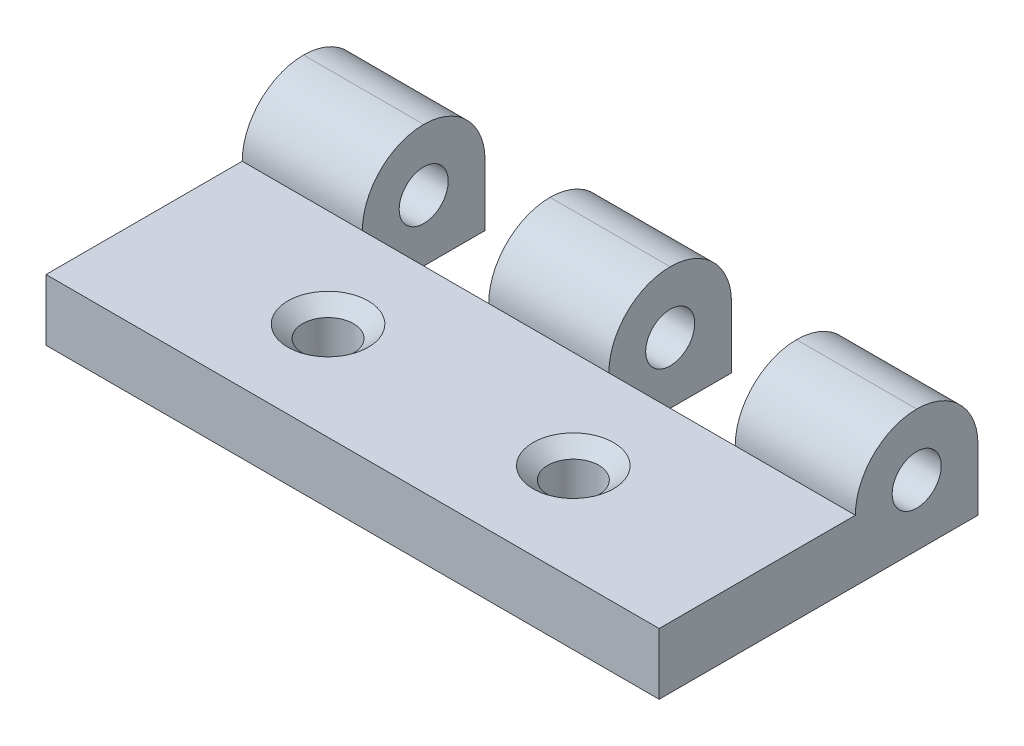
ISO-10303-21;
HEADER;
FILE_DESCRIPTION(('STEP AP214'),'2;1');
FILE_NAME('part.step','',(''),(''),'','','');
FILE_SCHEMA(('AUTOMOTIVE_DESIGN { 1 0 10303 214 1 1 1 1 }'));
ENDSEC;
DATA;
#1=APPLICATION_CONTEXT('core data for automotive mechanical design processes');
#2=APPLICATION_PROTOCOL_DEFINITION('international standard','automotive_design',2000,#1);
#3=PRODUCT_CONTEXT('',#1,'mechanical');
#4=PRODUCT('Part','Part','',(#3));
#5=PRODUCT_RELATED_PRODUCT_CATEGORY('part','',(#4));
#6=PRODUCT_DEFINITION_FORMATION('','',#4);
#7=PRODUCT_DEFINITION_CONTEXT('part definition',#1,'design');
#8=PRODUCT_DEFINITION('design','',#6,#7);
#9=PRODUCT_DEFINITION_SHAPE('','',#8);
#10=(LENGTH_UNIT() NAMED_UNIT(*) SI_UNIT(.MILLI.,.METRE.));
#11=(NAMED_UNIT(*) PLANE_ANGLE_UNIT() SI_UNIT($,.RADIAN.));
#12=(NAMED_UNIT(*) SI_UNIT($,.STERADIAN.) SOLID_ANGLE_UNIT());
#13=UNCERTAINTY_MEASURE_WITH_UNIT(LENGTH_MEASURE(1.E-05),#10,'distance_accuracy_value','');
#14=(GEOMETRIC_REPRESENTATION_CONTEXT(3) GLOBAL_UNCERTAINTY_ASSIGNED_CONTEXT((#13)) GLOBAL_UNIT_ASSIGNED_CONTEXT((#10,
#11,#12)) REPRESENTATION_CONTEXT('',''));
#15=CARTESIAN_POINT('',(0.,0.,0.));
#16=DIRECTION('',(0.,0.,1.));
#17=DIRECTION('',(1.,0.,0.));
#18=AXIS2_PLACEMENT_3D('',#15,#16,#17);
#19=CARTESIAN_POINT('',(-74.9999999999999,10.,-176.));
#20=DIRECTION('',(-1.,0.,0.));
#21=DIRECTION('',(0.,0.,1.));
#22=AXIS2_PLACEMENT_3D('',#19,#20,#21);
#23=PLANE('',#22);
#24=CARTESIAN_POINT('',(-74.9999999999999,5.,-171.));
#25=DIRECTION('',(-1.,0.,0.));
#26=DIRECTION('',(0.,0.,1.));
#27=AXIS2_PLACEMENT_3D('',#24,#25,#26);
#28=CIRCLE('',#27,2.);
#29=CARTESIAN_POINT('',(-74.9999999999999,5.,-169.));
#30=VERTEX_POINT('',#29);
#31=EDGE_CURVE('E206',#30,#30,#28,.T.);
#32=ORIENTED_EDGE('',*,*,#31,.T.);
#33=EDGE_LOOP('',(#32));
#34=FACE_BOUND('',#33,.T.);
#35=DIRECTION('',(0.,-1.,0.));
#36=VECTOR('',#35,1.);
#37=CARTESIAN_POINT('',(-74.9999999999999,10.,-176.));
#38=LINE('',#37,#36);
#39=CARTESIAN_POINT('',(-74.9999999999999,5.,-176.));
#40=VERTEX_POINT('',#39);
#41=CARTESIAN_POINT('',(-74.9999999999999,0.,-176.));
#42=VERTEX_POINT('',#41);
#43=EDGE_CURVE('E277',#40,#42,#38,.T.);
#44=ORIENTED_EDGE('',*,*,#43,.F.);
#45=CARTESIAN_POINT('',(-74.9999999999999,5.,-171.));
#46=DIRECTION('',(-1.,0.,0.));
#47=DIRECTION('',(0.,0.,1.));
#48=AXIS2_PLACEMENT_3D('',#45,#46,#47);
#49=CIRCLE('',#48,5.);
#50=CARTESIAN_POINT('',(-74.9999999999999,10.,-171.));
#51=VERTEX_POINT('',#50);
#52=EDGE_CURVE('E181',#40,#51,#49,.F.);
#53=ORIENTED_EDGE('',*,*,#52,.T.);
#54=CARTESIAN_POINT('',(-74.9999999999999,5.,-171.));
#55=DIRECTION('',(1.,0.,0.));
#56=DIRECTION('',(0.,0.,1.));
#57=AXIS2_PLACEMENT_3D('',#54,#55,#56);
#58=CIRCLE('',#57,4.99999999999992);
#59=CARTESIAN_POINT('',(-74.9999999999999,5.,-166.));
#60=VERTEX_POINT('',#59);
#61=EDGE_CURVE('E160',#51,#60,#58,.T.);
#62=ORIENTED_EDGE('',*,*,#61,.T.);
#63=DIRECTION('',(0.,0.,1.));
#64=VECTOR('',#63,1.);
#65=CARTESIAN_POINT('',(-74.9999999999999,5.,-150.));
#66=LINE('',#65,#64);
#67=CARTESIAN_POINT('',(-74.9999999999999,5.,-150.));
#68=VERTEX_POINT('',#67);
#69=EDGE_CURVE('E172',#60,#68,#66,.T.);
#70=ORIENTED_EDGE('',*,*,#69,.T.);
#71=DIRECTION('',(0.,-1.,0.));
#72=VECTOR('',#71,1.);
#73=CARTESIAN_POINT('',(-74.9999999999999,10.,-150.));
#74=LINE('',#73,#72);
#75=CARTESIAN_POINT('',(-74.9999999999999,0.,-150.));
#76=VERTEX_POINT('',#75);
#77=EDGE_CURVE('E279',#68,#76,#74,.T.);
#78=ORIENTED_EDGE('',*,*,#77,.T.);
#79=DIRECTION('',(0.,0.,-1.));
#80=VECTOR('',#79,1.);
#81=CARTESIAN_POINT('',(-74.9999999999999,0.,-176.));
#82=LINE('',#81,#80);
#83=EDGE_CURVE('E226',#76,#42,#82,.T.);
#84=ORIENTED_EDGE('',*,*,#83,.T.);
#85=EDGE_LOOP('',(#44,#53,#62,#70,#78,#84));
#86=FACE_BOUND('',#85,.T.);
#87=ADVANCED_FACE('F41',(#34,#86),#23,.F.);
#88=CARTESIAN_POINT('',(-84.7999999999999,10.,-166.));
#89=DIRECTION('',(1.,0.,0.));
#90=DIRECTION('',(0.,0.,-1.));
#91=AXIS2_PLACEMENT_3D('',#88,#89,#90);
#92=PLANE('',#91);
#93=CARTESIAN_POINT('',(-84.7999999999999,5.,-171.));
#94=DIRECTION('',(1.,0.,0.));
#95=DIRECTION('',(0.,0.,-1.));
#96=AXIS2_PLACEMENT_3D('',#93,#94,#95);
#97=CIRCLE('',#96,2.);
#98=CARTESIAN_POINT('',(-84.7999999999999,5.,-173.));
#99=VERTEX_POINT('',#98);
#100=EDGE_CURVE('E220',#99,#99,#97,.T.);
#101=ORIENTED_EDGE('',*,*,#100,.T.);
#102=EDGE_LOOP('',(#101));
#103=FACE_BOUND('',#102,.T.);
#104=CARTESIAN_POINT('',(-84.7999999999999,5.,-171.));
#105=DIRECTION('',(1.,0.,0.));
#106=DIRECTION('',(0.,0.,-1.));
#107=AXIS2_PLACEMENT_3D('',#104,#105,#106);
#108=CIRCLE('',#107,4.99999999999992);
#109=CARTESIAN_POINT('',(-84.7999999999999,5.,-166.));
#110=VERTEX_POINT('',#109);
#111=CARTESIAN_POINT('',(-84.7999999999999,9.99999999999992,-171.));
#112=VERTEX_POINT('',#111);
#113=EDGE_CURVE('E163',#110,#112,#108,.F.);
#114=ORIENTED_EDGE('',*,*,#113,.T.);
#115=CARTESIAN_POINT('',(-84.7999999999999,5.,-171.));
#116=DIRECTION('',(1.,0.,0.));
#117=DIRECTION('',(0.,0.,-1.));
#118=AXIS2_PLACEMENT_3D('',#115,#116,#117);
#119=CIRCLE('',#118,5.);
#120=CARTESIAN_POINT('',(-84.7999999999999,5.,-176.));
#121=VERTEX_POINT('',#120);
#122=EDGE_CURVE('E287',#112,#121,#119,.F.);
#123=ORIENTED_EDGE('',*,*,#122,.T.);
#124=DIRECTION('',(0.,-1.,0.));
#125=VECTOR('',#124,1.);
#126=CARTESIAN_POINT('',(-84.7999999999999,10.,-176.));
#127=LINE('',#126,#125);
#128=CARTESIAN_POINT('',(-84.7999999999999,0.,-176.));
#129=VERTEX_POINT('',#128);
#130=EDGE_CURVE('E275',#121,#129,#127,.T.);
#131=ORIENTED_EDGE('',*,*,#130,.T.);
#132=DIRECTION('',(0.,0.,1.));
#133=VECTOR('',#132,1.);
#134=CARTESIAN_POINT('',(-84.7999999999999,0.,-166.));
#135=LINE('',#134,#133);
#136=CARTESIAN_POINT('',(-84.7999999999999,0.,-166.));
#137=VERTEX_POINT('',#136);
#138=EDGE_CURVE('E232',#129,#137,#135,.T.);
#139=ORIENTED_EDGE('',*,*,#138,.T.);
#140=DIRECTION('',(0.,-1.,0.));
#141=VECTOR('',#140,1.);
#142=CARTESIAN_POINT('',(-84.7999999999999,10.,-166.));
#143=LINE('',#142,#141);
#144=EDGE_CURVE('E273',#110,#137,#143,.T.);
#145=ORIENTED_EDGE('',*,*,#144,.F.);
#146=EDGE_LOOP('',(#114,#123,#131,#139,#145));
#147=FACE_BOUND('',#146,.T.);
#148=ADVANCED_FACE('F342',(#103,#147),#92,.F.);
#149=CARTESIAN_POINT('',(-95.0999999999999,10.,-176.));
#150=DIRECTION('',(-1.,0.,0.));
#151=DIRECTION('',(0.,0.,1.));
#152=AXIS2_PLACEMENT_3D('',#149,#150,#151);
#153=PLANE('',#152);
#154=CARTESIAN_POINT('',(-95.0999999999999,5.,-171.));
#155=DIRECTION('',(-1.,0.,0.));
#156=DIRECTION('',(0.,0.,1.));
#157=AXIS2_PLACEMENT_3D('',#154,#155,#156);
#158=CIRCLE('',#157,2.);
#159=CARTESIAN_POINT('',(-95.0999999999999,5.,-169.));
#160=VERTEX_POINT('',#159);
#161=EDGE_CURVE('E217',#160,#160,#158,.T.);
#162=ORIENTED_EDGE('',*,*,#161,.T.);
#163=EDGE_LOOP('',(#162));
#164=FACE_BOUND('',#163,.T.);
#165=DIRECTION('',(0.,-1.,0.));
#166=VECTOR('',#165,1.);
#167=CARTESIAN_POINT('',(-95.0999999999999,10.,-176.));
#168=LINE('',#167,#166);
#169=CARTESIAN_POINT('',(-95.0999999999999,5.,-176.));
#170=VERTEX_POINT('',#169);
#171=CARTESIAN_POINT('',(-95.0999999999999,0.,-176.));
#172=VERTEX_POINT('',#171);
#173=EDGE_CURVE('E269',#170,#172,#168,.T.);
#174=ORIENTED_EDGE('',*,*,#173,.F.);
#175=CARTESIAN_POINT('',(-95.0999999999999,5.,-171.));
#176=DIRECTION('',(-1.,0.,0.));
#177=DIRECTION('',(0.,0.,1.));
#178=AXIS2_PLACEMENT_3D('',#175,#176,#177);
#179=CIRCLE('',#178,5.);
#180=CARTESIAN_POINT('',(-95.0999999999999,9.99999999999992,-171.));
#181=VERTEX_POINT('',#180);
#182=EDGE_CURVE('E296',#170,#181,#179,.F.);
#183=ORIENTED_EDGE('',*,*,#182,.T.);
#184=CARTESIAN_POINT('',(-95.0999999999999,5.,-171.));
#185=DIRECTION('',(-1.,0.,0.));
#186=DIRECTION('',(0.,0.,1.));
#187=AXIS2_PLACEMENT_3D('',#184,#185,#186);
#188=CIRCLE('',#187,4.99999999999992);
#189=CARTESIAN_POINT('',(-95.0999999999999,5.,-166.));
#190=VERTEX_POINT('',#189);
#191=EDGE_CURVE('E201',#181,#190,#188,.F.);
#192=ORIENTED_EDGE('',*,*,#191,.T.);
#193=DIRECTION('',(0.,-1.,0.));
#194=VECTOR('',#193,1.);
#195=CARTESIAN_POINT('',(-95.0999999999999,10.,-166.));
#196=LINE('',#195,#194);
#197=CARTESIAN_POINT('',(-95.0999999999999,0.,-166.));
#198=VERTEX_POINT('',#197);
#199=EDGE_CURVE('E271',#190,#198,#196,.T.);
#200=ORIENTED_EDGE('',*,*,#199,.T.);
#201=DIRECTION('',(0.,0.,-1.));
#202=VECTOR('',#201,1.);
#203=CARTESIAN_POINT('',(-95.0999999999999,0.,-176.));
#204=LINE('',#203,#202);
#205=EDGE_CURVE('E238',#198,#172,#204,.T.);
#206=ORIENTED_EDGE('',*,*,#205,.T.);
#207=EDGE_LOOP('',(#174,#183,#192,#200,#206));
#208=FACE_BOUND('',#207,.T.);
#209=ADVANCED_FACE('F349',(#164,#208),#153,.F.);
#210=CARTESIAN_POINT('',(-104.9,10.,-166.));
#211=DIRECTION('',(1.,0.,0.));
#212=DIRECTION('',(0.,0.,-1.));
#213=AXIS2_PLACEMENT_3D('',#210,#211,#212);
#214=PLANE('',#213);
#215=CARTESIAN_POINT('',(-104.9,5.,-171.));
#216=DIRECTION('',(1.,0.,0.));
#217=DIRECTION('',(0.,0.,-1.));
#218=AXIS2_PLACEMENT_3D('',#215,#216,#217);
#219=CIRCLE('',#218,2.);
#220=CARTESIAN_POINT('',(-104.9,5.,-173.));
#221=VERTEX_POINT('',#220);
#222=EDGE_CURVE('E214',#221,#221,#219,.T.);
#223=ORIENTED_EDGE('',*,*,#222,.T.);
#224=EDGE_LOOP('',(#223));
#225=FACE_BOUND('',#224,.T.);
#226=CARTESIAN_POINT('',(-104.9,5.,-171.));
#227=DIRECTION('',(1.,0.,0.));
#228=DIRECTION('',(0.,0.,-1.));
#229=AXIS2_PLACEMENT_3D('',#226,#227,#228);
#230=CIRCLE('',#229,4.99999999999992);
#231=CARTESIAN_POINT('',(-104.9,5.,-166.));
#232=VERTEX_POINT('',#231);
#233=CARTESIAN_POINT('',(-104.9,9.99999999999992,-171.));
#234=VERTEX_POINT('',#233);
#235=EDGE_CURVE('E198',#232,#234,#230,.F.);
#236=ORIENTED_EDGE('',*,*,#235,.T.);
#237=CARTESIAN_POINT('',(-104.9,5.,-171.));
#238=DIRECTION('',(1.,0.,0.));
#239=DIRECTION('',(0.,0.,-1.));
#240=AXIS2_PLACEMENT_3D('',#237,#238,#239);
#241=CIRCLE('',#240,5.);
#242=CARTESIAN_POINT('',(-104.9,5.,-176.));
#243=VERTEX_POINT('',#242);
#244=EDGE_CURVE('E292',#234,#243,#241,.F.);
#245=ORIENTED_EDGE('',*,*,#244,.T.);
#246=DIRECTION('',(0.,-1.,0.));
#247=VECTOR('',#246,1.);
#248=CARTESIAN_POINT('',(-104.9,10.,-176.));
#249=LINE('',#248,#247);
#250=CARTESIAN_POINT('',(-104.9,0.,-176.));
#251=VERTEX_POINT('',#250);
#252=EDGE_CURVE('E267',#243,#251,#249,.T.);
#253=ORIENTED_EDGE('',*,*,#252,.T.);
#254=DIRECTION('',(0.,0.,1.));
#255=VECTOR('',#254,1.);
#256=CARTESIAN_POINT('',(-104.9,0.,-166.));
#257=LINE('',#256,#255);
#258=CARTESIAN_POINT('',(-104.9,0.,-166.));
#259=VERTEX_POINT('',#258);
#260=EDGE_CURVE('E244',#251,#259,#257,.T.);
#261=ORIENTED_EDGE('',*,*,#260,.T.);
#262=DIRECTION('',(0.,-1.,0.));
#263=VECTOR('',#262,1.);
#264=CARTESIAN_POINT('',(-104.9,10.,-166.));
#265=LINE('',#264,#263);
#266=EDGE_CURVE('E265',#232,#259,#265,.T.);
#267=ORIENTED_EDGE('',*,*,#266,.F.);
#268=EDGE_LOOP('',(#236,#245,#253,#261,#267));
#269=FACE_BOUND('',#268,.T.);
#270=ADVANCED_FACE('F411',(#225,#269),#214,.F.);
#271=CARTESIAN_POINT('',(-115.2,10.,-176.));
#272=DIRECTION('',(-1.,0.,0.));
#273=DIRECTION('',(0.,0.,1.));
#274=AXIS2_PLACEMENT_3D('',#271,#272,#273);
#275=PLANE('',#274);
#276=CARTESIAN_POINT('',(-115.2,5.,-171.));
#277=DIRECTION('',(-1.,0.,0.));
#278=DIRECTION('',(0.,0.,1.));
#279=AXIS2_PLACEMENT_3D('',#276,#277,#278);
#280=CIRCLE('',#279,2.);
#281=CARTESIAN_POINT('',(-115.2,5.,-169.));
#282=VERTEX_POINT('',#281);
#283=EDGE_CURVE('E209',#282,#282,#280,.T.);
#284=ORIENTED_EDGE('',*,*,#283,.T.);
#285=EDGE_LOOP('',(#284));
#286=FACE_BOUND('',#285,.T.);
#287=DIRECTION('',(0.,-1.,0.));
#288=VECTOR('',#287,1.);
#289=CARTESIAN_POINT('',(-115.2,10.,-176.));
#290=LINE('',#289,#288);
#291=CARTESIAN_POINT('',(-115.2,5.,-176.));
#292=VERTEX_POINT('',#291);
#293=CARTESIAN_POINT('',(-115.2,0.,-176.));
#294=VERTEX_POINT('',#293);
#295=EDGE_CURVE('E261',#292,#294,#290,.T.);
#296=ORIENTED_EDGE('',*,*,#295,.F.);
#297=CARTESIAN_POINT('',(-115.2,5.,-171.));
#298=DIRECTION('',(-1.,0.,0.));
#299=DIRECTION('',(0.,0.,1.));
#300=AXIS2_PLACEMENT_3D('',#297,#298,#299);
#301=CIRCLE('',#300,5.);
#302=CARTESIAN_POINT('',(-115.2,9.99999999999992,-171.));
#303=VERTEX_POINT('',#302);
#304=EDGE_CURVE('E300',#292,#303,#301,.F.);
#305=ORIENTED_EDGE('',*,*,#304,.T.);
#306=CARTESIAN_POINT('',(-115.2,5.,-171.));
#307=DIRECTION('',(-1.,0.,0.));
#308=DIRECTION('',(0.,0.,1.));
#309=AXIS2_PLACEMENT_3D('',#306,#307,#308);
#310=CIRCLE('',#309,4.99999999999992);
#311=CARTESIAN_POINT('',(-115.2,5.,-166.));
#312=VERTEX_POINT('',#311);
#313=EDGE_CURVE('E193',#303,#312,#310,.F.);
#314=ORIENTED_EDGE('',*,*,#313,.T.);
#315=DIRECTION('',(0.,-1.,0.));
#316=VECTOR('',#315,1.);
#317=CARTESIAN_POINT('',(-115.2,10.,-166.));
#318=LINE('',#317,#316);
#319=CARTESIAN_POINT('',(-115.2,0.,-166.));
#320=VERTEX_POINT('',#319);
#321=EDGE_CURVE('E263',#312,#320,#318,.T.);
#322=ORIENTED_EDGE('',*,*,#321,.T.);
#323=DIRECTION('',(0.,0.,-1.));
#324=VECTOR('',#323,1.);
#325=CARTESIAN_POINT('',(-115.2,0.,-176.));
#326=LINE('',#325,#324);
#327=EDGE_CURVE('E250',#320,#294,#326,.T.);
#328=ORIENTED_EDGE('',*,*,#327,.T.);
#329=EDGE_LOOP('',(#296,#305,#314,#322,#328));
#330=FACE_BOUND('',#329,.T.);
#331=ADVANCED_FACE('F377',(#286,#330),#275,.F.);
#332=CARTESIAN_POINT('',(-125.,10.,-166.));
#333=DIRECTION('',(1.,0.,0.));
#334=DIRECTION('',(0.,0.,-1.));
#335=AXIS2_PLACEMENT_3D('',#332,#333,#334);
#336=PLANE('',#335);
#337=CARTESIAN_POINT('',(-125.,5.,-171.));
#338=DIRECTION('',(-1.,0.,0.));
#339=DIRECTION('',(0.,0.,1.));
#340=AXIS2_PLACEMENT_3D('',#337,#338,#339);
#341=CIRCLE('',#340,2.);
#342=CARTESIAN_POINT('',(-125.,5.,-169.));
#343=VERTEX_POINT('',#342);
#344=EDGE_CURVE('E205',#343,#343,#341,.T.);
#345=ORIENTED_EDGE('',*,*,#344,.F.);
#346=EDGE_LOOP('',(#345));
#347=FACE_BOUND('',#346,.T.);
#348=CARTESIAN_POINT('',(-125.,5.,-171.));
#349=DIRECTION('',(1.,0.,0.));
#350=DIRECTION('',(0.,0.,1.));
#351=AXIS2_PLACEMENT_3D('',#348,#349,#350);
#352=CIRCLE('',#351,4.99999999999992);
#353=CARTESIAN_POINT('',(-125.,9.99999999999992,-171.));
#354=VERTEX_POINT('',#353);
#355=CARTESIAN_POINT('',(-125.,5.,-166.));
#356=VERTEX_POINT('',#355);
#357=EDGE_CURVE('E184',#354,#356,#352,.T.);
#358=ORIENTED_EDGE('',*,*,#357,.F.);
#359=CARTESIAN_POINT('',(-125.,5.,-171.));
#360=DIRECTION('',(1.,0.,0.));
#361=DIRECTION('',(0.,0.,-1.));
#362=AXIS2_PLACEMENT_3D('',#359,#360,#361);
#363=CIRCLE('',#362,5.);
#364=CARTESIAN_POINT('',(-125.,5.,-176.));
#365=VERTEX_POINT('',#364);
#366=EDGE_CURVE('E65',#354,#365,#363,.F.);
#367=ORIENTED_EDGE('',*,*,#366,.T.);
#368=DIRECTION('',(0.,-1.,0.));
#369=VECTOR('',#368,1.);
#370=CARTESIAN_POINT('',(-125.,10.,-176.));
#371=LINE('',#370,#369);
#372=CARTESIAN_POINT('',(-125.,0.,-176.));
#373=VERTEX_POINT('',#372);
#374=EDGE_CURVE('E259',#365,#373,#371,.T.);
#375=ORIENTED_EDGE('',*,*,#374,.T.);
#376=DIRECTION('',(0.,0.,1.));
#377=VECTOR('',#376,1.);
#378=CARTESIAN_POINT('',(-125.,0.,-166.));
#379=LINE('',#378,#377);
#380=CARTESIAN_POINT('',(-125.,0.,-150.));
#381=VERTEX_POINT('',#380);
#382=EDGE_CURVE('E256',#373,#381,#379,.T.);
#383=ORIENTED_EDGE('',*,*,#382,.T.);
#384=DIRECTION('',(0.,-1.,0.));
#385=VECTOR('',#384,1.);
#386=CARTESIAN_POINT('',(-125.,10.,-150.));
#387=LINE('',#386,#385);
#388=CARTESIAN_POINT('',(-125.,5.,-150.));
#389=VERTEX_POINT('',#388);
#390=EDGE_CURVE('E281',#389,#381,#387,.T.);
#391=ORIENTED_EDGE('',*,*,#390,.F.);
#392=DIRECTION('',(0.,0.,1.));
#393=VECTOR('',#392,1.);
#394=CARTESIAN_POINT('',(-125.,5.,-150.));
#395=LINE('',#394,#393);
#396=EDGE_CURVE('E182',#356,#389,#395,.T.);
#397=ORIENTED_EDGE('',*,*,#396,.F.);
#398=EDGE_LOOP('',(#358,#367,#375,#383,#391,#397));
#399=FACE_BOUND('',#398,.T.);
#400=ADVANCED_FACE('F357',(#347,#399),#336,.F.);
#401=CARTESIAN_POINT('',(-125.,10.,-150.));
#402=DIRECTION('',(0.,0.,-1.));
#403=DIRECTION('',(-1.,0.,0.));
#404=AXIS2_PLACEMENT_3D('',#401,#402,#403);
#405=PLANE('',#404);
#406=ORIENTED_EDGE('',*,*,#77,.F.);
#407=DIRECTION('',(-1.,0.,0.));
#408=VECTOR('',#407,1.);
#409=CARTESIAN_POINT('',(-74.9999999999999,5.,-150.));
#410=LINE('',#409,#408);
#411=EDGE_CURVE('E167',#68,#389,#410,.T.);
#412=ORIENTED_EDGE('',*,*,#411,.T.);
#413=ORIENTED_EDGE('',*,*,#390,.T.);
#414=DIRECTION('',(1.,0.,0.));
#415=VECTOR('',#414,1.);
#416=CARTESIAN_POINT('',(-125.,0.,-150.));
#417=LINE('',#416,#415);
#418=EDGE_CURVE('E223',#381,#76,#417,.T.);
#419=ORIENTED_EDGE('',*,*,#418,.T.);
#420=EDGE_LOOP('',(#406,#412,#413,#419));
#421=FACE_BOUND('',#420,.T.);
#422=ADVANCED_FACE('F355',(#421),#405,.F.);
#423=CARTESIAN_POINT('',(-84.7999999999999,10.,-176.));
#424=DIRECTION('',(0.,0.,1.));
#425=DIRECTION('',(1.,0.,0.));
#426=AXIS2_PLACEMENT_3D('',#423,#424,#425);
#427=PLANE('',#426);
#428=ORIENTED_EDGE('',*,*,#130,.F.);
#429=DIRECTION('',(-1.,0.,0.));
#430=VECTOR('',#429,1.);
#431=CARTESIAN_POINT('',(-84.7999999999999,5.,-176.));
#432=LINE('',#431,#430);
#433=EDGE_CURVE('E289',#121,#40,#432,.F.);
#434=ORIENTED_EDGE('',*,*,#433,.T.);
#435=ORIENTED_EDGE('',*,*,#43,.T.);
#436=DIRECTION('',(-1.,0.,0.));
#437=VECTOR('',#436,1.);
#438=CARTESIAN_POINT('',(-84.7999999999999,0.,-176.));
#439=LINE('',#438,#437);
#440=EDGE_CURVE('E229',#42,#129,#439,.T.);
#441=ORIENTED_EDGE('',*,*,#440,.T.);
#442=EDGE_LOOP('',(#428,#434,#435,#441));
#443=FACE_BOUND('',#442,.T.);
#444=ADVANCED_FACE('F354',(#443),#427,.F.);
#445=CARTESIAN_POINT('',(-95.0999999999999,10.,-166.));
#446=DIRECTION('',(0.,0.,1.));
#447=DIRECTION('',(1.,0.,0.));
#448=AXIS2_PLACEMENT_3D('',#445,#446,#447);
#449=PLANE('',#448);
#450=ORIENTED_EDGE('',*,*,#199,.F.);
#451=DIRECTION('',(-1.,0.,0.));
#452=VECTOR('',#451,1.);
#453=CARTESIAN_POINT('',(-74.9999999999999,5.,-166.));
#454=LINE('',#453,#452);
#455=EDGE_CURVE('E168',#110,#190,#454,.T.);
#456=ORIENTED_EDGE('',*,*,#455,.F.);
#457=ORIENTED_EDGE('',*,*,#144,.T.);
#458=DIRECTION('',(-1.,0.,0.));
#459=VECTOR('',#458,1.);
#460=CARTESIAN_POINT('',(-95.0999999999999,0.,-166.));
#461=LINE('',#460,#459);
#462=EDGE_CURVE('E235',#137,#198,#461,.T.);
#463=ORIENTED_EDGE('',*,*,#462,.T.);
#464=EDGE_LOOP('',(#450,#456,#457,#463));
#465=FACE_BOUND('',#464,.T.);
#466=ADVANCED_FACE('F399',(#465),#449,.F.);
#467=CARTESIAN_POINT('',(-104.9,10.,-176.));
#468=DIRECTION('',(0.,0.,1.));
#469=DIRECTION('',(1.,0.,0.));
#470=AXIS2_PLACEMENT_3D('',#467,#468,#469);
#471=PLANE('',#470);
#472=ORIENTED_EDGE('',*,*,#252,.F.);
#473=DIRECTION('',(-1.,0.,0.));
#474=VECTOR('',#473,1.);
#475=CARTESIAN_POINT('',(-104.9,5.,-176.));
#476=LINE('',#475,#474);
#477=EDGE_CURVE('E294',#243,#170,#476,.F.);
#478=ORIENTED_EDGE('',*,*,#477,.T.);
#479=ORIENTED_EDGE('',*,*,#173,.T.);
#480=DIRECTION('',(-1.,0.,0.));
#481=VECTOR('',#480,1.);
#482=CARTESIAN_POINT('',(-104.9,0.,-176.));
#483=LINE('',#482,#481);
#484=EDGE_CURVE('E241',#172,#251,#483,.T.);
#485=ORIENTED_EDGE('',*,*,#484,.T.);
#486=EDGE_LOOP('',(#472,#478,#479,#485));
#487=FACE_BOUND('',#486,.T.);
#488=ADVANCED_FACE('F432',(#487),#471,.F.);
#489=CARTESIAN_POINT('',(-115.2,10.,-166.));
#490=DIRECTION('',(0.,0.,1.));
#491=DIRECTION('',(1.,0.,0.));
#492=AXIS2_PLACEMENT_3D('',#489,#490,#491);
#493=PLANE('',#492);
#494=ORIENTED_EDGE('',*,*,#321,.F.);
#495=EDGE_CURVE('E383',#232,#312,#454,.T.);
#496=ORIENTED_EDGE('',*,*,#495,.F.);
#497=ORIENTED_EDGE('',*,*,#266,.T.);
#498=DIRECTION('',(-1.,0.,0.));
#499=VECTOR('',#498,1.);
#500=CARTESIAN_POINT('',(-115.2,0.,-166.));
#501=LINE('',#500,#499);
#502=EDGE_CURVE('E247',#259,#320,#501,.T.);
#503=ORIENTED_EDGE('',*,*,#502,.T.);
#504=EDGE_LOOP('',(#494,#496,#497,#503));
#505=FACE_BOUND('',#504,.T.);
#506=ADVANCED_FACE('F414',(#505),#493,.F.);
#507=CARTESIAN_POINT('',(-125.,10.,-176.));
#508=DIRECTION('',(0.,0.,1.));
#509=DIRECTION('',(1.,0.,0.));
#510=AXIS2_PLACEMENT_3D('',#507,#508,#509);
#511=PLANE('',#510);
#512=ORIENTED_EDGE('',*,*,#374,.F.);
#513=DIRECTION('',(-1.,0.,0.));
#514=VECTOR('',#513,1.);
#515=CARTESIAN_POINT('',(-125.,5.,-176.));
#516=LINE('',#515,#514);
#517=EDGE_CURVE('E57',#365,#292,#516,.F.);
#518=ORIENTED_EDGE('',*,*,#517,.T.);
#519=ORIENTED_EDGE('',*,*,#295,.T.);
#520=DIRECTION('',(-1.,0.,0.));
#521=VECTOR('',#520,1.);
#522=CARTESIAN_POINT('',(-125.,0.,-176.));
#523=LINE('',#522,#521);
#524=EDGE_CURVE('E253',#294,#373,#523,.T.);
#525=ORIENTED_EDGE('',*,*,#524,.T.);
#526=EDGE_LOOP('',(#512,#518,#519,#525));
#527=FACE_BOUND('',#526,.T.);
#528=ADVANCED_FACE('F418',(#527),#511,.F.);
#529=CARTESIAN_POINT('',(0.,0.,0.));
#530=DIRECTION('',(0.,-1.,0.));
#531=DIRECTION('',(0.,0.,-1.));
#532=AXIS2_PLACEMENT_3D('',#529,#530,#531);
#533=PLANE('',#532);
#534=CARTESIAN_POINT('',(-110.,0.,-158.));
#535=DIRECTION('',(0.,1.,0.));
#536=DIRECTION('',(0.,0.,1.));
#537=AXIS2_PLACEMENT_3D('',#534,#535,#536);
#538=CIRCLE('',#537,2.07645);
#539=CARTESIAN_POINT('',(-110.,0.,-155.92355));
#540=VERTEX_POINT('',#539);
#541=EDGE_CURVE('E191',#540,#540,#538,.T.);
#542=ORIENTED_EDGE('',*,*,#541,.T.);
#543=EDGE_LOOP('',(#542));
#544=FACE_BOUND('',#543,.T.);
#545=CARTESIAN_POINT('',(-89.9999999999999,0.,-158.));
#546=DIRECTION('',(0.,1.,0.));
#547=DIRECTION('',(0.,0.,1.));
#548=AXIS2_PLACEMENT_3D('',#545,#546,#547);
#549=CIRCLE('',#548,2.07645);
#550=CARTESIAN_POINT('',(-89.9999999999999,0.,-155.92355));
#551=VERTEX_POINT('',#550);
#552=EDGE_CURVE('E187',#551,#551,#549,.T.);
#553=ORIENTED_EDGE('',*,*,#552,.T.);
#554=EDGE_LOOP('',(#553));
#555=FACE_BOUND('',#554,.T.);
#556=ORIENTED_EDGE('',*,*,#418,.F.);
#557=ORIENTED_EDGE('',*,*,#382,.F.);
#558=ORIENTED_EDGE('',*,*,#524,.F.);
#559=ORIENTED_EDGE('',*,*,#327,.F.);
#560=ORIENTED_EDGE('',*,*,#502,.F.);
#561=ORIENTED_EDGE('',*,*,#260,.F.);
#562=ORIENTED_EDGE('',*,*,#484,.F.);
#563=ORIENTED_EDGE('',*,*,#205,.F.);
#564=ORIENTED_EDGE('',*,*,#462,.F.);
#565=ORIENTED_EDGE('',*,*,#138,.F.);
#566=ORIENTED_EDGE('',*,*,#440,.F.);
#567=ORIENTED_EDGE('',*,*,#83,.F.);
#568=EDGE_LOOP('',(#556,#557,#558,#559,#560,#561,#562,#563,#564,#565,#566,#567));
#569=FACE_BOUND('',#568,.T.);
#570=ADVANCED_FACE('F329',(#544,#555,#569),#533,.T.);
#571=CARTESIAN_POINT('',(-74.9999999999999,5.,-171.));
#572=DIRECTION('',(-1.,0.,0.));
#573=DIRECTION('',(0.,0.,1.));
#574=AXIS2_PLACEMENT_3D('',#571,#572,#573);
#575=CYLINDRICAL_SURFACE('',#574,2.);
#576=ORIENTED_EDGE('',*,*,#344,.T.);
#577=EDGE_LOOP('',(#576));
#578=FACE_BOUND('',#577,.T.);
#579=ORIENTED_EDGE('',*,*,#283,.F.);
#580=EDGE_LOOP('',(#579));
#581=FACE_BOUND('',#580,.T.);
#582=ADVANCED_FACE('F457',(#578,#581),#575,.F.);
#583=ORIENTED_EDGE('',*,*,#222,.F.);
#584=EDGE_LOOP('',(#583));
#585=FACE_BOUND('',#584,.T.);
#586=ORIENTED_EDGE('',*,*,#161,.F.);
#587=EDGE_LOOP('',(#586));
#588=FACE_BOUND('',#587,.T.);
#589=ADVANCED_FACE('F461',(#585,#588),#575,.F.);
#590=ORIENTED_EDGE('',*,*,#31,.F.);
#591=EDGE_LOOP('',(#590));
#592=FACE_BOUND('',#591,.T.);
#593=ORIENTED_EDGE('',*,*,#100,.F.);
#594=EDGE_LOOP('',(#593));
#595=FACE_BOUND('',#594,.T.);
#596=ADVANCED_FACE('F458',(#592,#595),#575,.F.);
#597=CARTESIAN_POINT('',(-74.9999999999999,5.,-171.));
#598=DIRECTION('',(-1.,0.,0.));
#599=DIRECTION('',(0.,0.,1.));
#600=AXIS2_PLACEMENT_3D('',#597,#598,#599);
#601=CYLINDRICAL_SURFACE('',#600,4.99999999999992);
#602=EDGE_CURVE('E155',#60,#110,#454,.T.);
#603=ORIENTED_EDGE('',*,*,#602,.F.);
#604=ORIENTED_EDGE('',*,*,#61,.F.);
#605=DIRECTION('',(-1.,0.,0.));
#606=VECTOR('',#605,1.);
#607=CARTESIAN_POINT('',(-74.9999999999999,9.99999999999992,-171.));
#608=LINE('',#607,#606);
#609=EDGE_CURVE('E177',#51,#112,#608,.T.);
#610=ORIENTED_EDGE('',*,*,#609,.T.);
#611=ORIENTED_EDGE('',*,*,#113,.F.);
#612=EDGE_LOOP('',(#603,#604,#610,#611));
#613=FACE_BOUND('',#612,.T.);
#614=ADVANCED_FACE('F157',(#613),#601,.T.);
#615=DIRECTION('',(1.,0.,0.));
#616=VECTOR('',#615,1.);
#617=CARTESIAN_POINT('',(0.,10.,-171.));
#618=LINE('',#617,#616);
#619=EDGE_CURVE('E283',#234,#181,#618,.T.);
#620=ORIENTED_EDGE('',*,*,#619,.F.);
#621=ORIENTED_EDGE('',*,*,#235,.F.);
#622=EDGE_CURVE('E386',#190,#232,#454,.T.);
#623=ORIENTED_EDGE('',*,*,#622,.F.);
#624=ORIENTED_EDGE('',*,*,#191,.F.);
#625=EDGE_LOOP('',(#620,#621,#623,#624));
#626=FACE_BOUND('',#625,.T.);
#627=ADVANCED_FACE('F409',(#626),#601,.T.);
#628=EDGE_CURVE('E284',#354,#303,#618,.T.);
#629=ORIENTED_EDGE('',*,*,#628,.F.);
#630=ORIENTED_EDGE('',*,*,#357,.T.);
#631=EDGE_CURVE('E170',#312,#356,#454,.T.);
#632=ORIENTED_EDGE('',*,*,#631,.F.);
#633=ORIENTED_EDGE('',*,*,#313,.F.);
#634=EDGE_LOOP('',(#629,#630,#632,#633));
#635=FACE_BOUND('',#634,.T.);
#636=ADVANCED_FACE('F380',(#635),#601,.T.);
#637=CARTESIAN_POINT('',(-74.9999999999999,5.,-150.));
#638=DIRECTION('',(0.,-1.,0.));
#639=DIRECTION('',(0.,0.,-1.));
#640=AXIS2_PLACEMENT_3D('',#637,#638,#639);
#641=PLANE('',#640);
#642=CARTESIAN_POINT('',(-89.9999999999999,5.,-158.));
#643=DIRECTION('',(0.,-1.,0.));
#644=DIRECTION('',(0.,0.,-1.));
#645=AXIS2_PLACEMENT_3D('',#642,#643,#644);
#646=CIRCLE('',#645,3.27645000000004);
#647=CARTESIAN_POINT('',(-89.9999999999999,5.,-161.27645));
#648=VERTEX_POINT('',#647);
#649=EDGE_CURVE('E50',#648,#648,#646,.T.);
#650=ORIENTED_EDGE('',*,*,#649,.T.);
#651=EDGE_LOOP('',(#650));
#652=FACE_BOUND('',#651,.T.);
#653=CARTESIAN_POINT('',(-110.,5.,-158.));
#654=DIRECTION('',(0.,-1.,0.));
#655=DIRECTION('',(0.,0.,-1.));
#656=AXIS2_PLACEMENT_3D('',#653,#654,#655);
#657=CIRCLE('',#656,3.27645000000004);
#658=CARTESIAN_POINT('',(-110.,5.,-161.27645));
#659=VERTEX_POINT('',#658);
#660=EDGE_CURVE('E305',#659,#659,#657,.T.);
#661=ORIENTED_EDGE('',*,*,#660,.T.);
#662=EDGE_LOOP('',(#661));
#663=FACE_BOUND('',#662,.T.);
#664=ORIENTED_EDGE('',*,*,#396,.T.);
#665=ORIENTED_EDGE('',*,*,#411,.F.);
#666=ORIENTED_EDGE('',*,*,#69,.F.);
#667=ORIENTED_EDGE('',*,*,#602,.T.);
#668=ORIENTED_EDGE('',*,*,#455,.T.);
#669=ORIENTED_EDGE('',*,*,#622,.T.);
#670=ORIENTED_EDGE('',*,*,#495,.T.);
#671=ORIENTED_EDGE('',*,*,#631,.T.);
#672=EDGE_LOOP('',(#664,#665,#666,#667,#668,#669,#670,#671));
#673=FACE_BOUND('',#672,.T.);
#674=ADVANCED_FACE('F173',(#652,#663,#673),#641,.F.);
#675=CARTESIAN_POINT('',(-89.9999999999999,0.,-158.));
#676=DIRECTION('',(0.,1.,0.));
#677=DIRECTION('',(0.,0.,1.));
#678=AXIS2_PLACEMENT_3D('',#675,#676,#677);
#679=CYLINDRICAL_SURFACE('',#678,2.07645);
#680=CARTESIAN_POINT('',(-89.9999999999999,3.99308044258725,-158.));
#681=DIRECTION('',(0.,-1.,0.));
#682=DIRECTION('',(0.,0.,-1.));
#683=AXIS2_PLACEMENT_3D('',#680,#681,#682);
#684=CIRCLE('',#683,2.07645);
#685=CARTESIAN_POINT('',(-89.9999999999999,3.99308044258725,-160.07645));
#686=VERTEX_POINT('',#685);
#687=EDGE_CURVE('E302',#686,#686,#684,.F.);
#688=ORIENTED_EDGE('',*,*,#687,.T.);
#689=EDGE_LOOP('',(#688));
#690=FACE_BOUND('',#689,.T.);
#691=ORIENTED_EDGE('',*,*,#552,.F.);
#692=EDGE_LOOP('',(#691));
#693=FACE_BOUND('',#692,.T.);
#694=ADVANCED_FACE('F318',(#690,#693),#679,.F.);
#695=CARTESIAN_POINT('',(-110.,0.,-158.));
#696=DIRECTION('',(0.,1.,0.));
#697=DIRECTION('',(0.,0.,1.));
#698=AXIS2_PLACEMENT_3D('',#695,#696,#697);
#699=CYLINDRICAL_SURFACE('',#698,2.07645);
#700=CARTESIAN_POINT('',(-110.,3.99308044258725,-158.));
#701=DIRECTION('',(0.,-1.,0.));
#702=DIRECTION('',(0.,0.,-1.));
#703=AXIS2_PLACEMENT_3D('',#700,#701,#702);
#704=CIRCLE('',#703,2.07645);
#705=CARTESIAN_POINT('',(-110.,3.99308044258725,-160.07645));
#706=VERTEX_POINT('',#705);
#707=EDGE_CURVE('E11',#706,#706,#704,.F.);
#708=ORIENTED_EDGE('',*,*,#707,.T.);
#709=EDGE_LOOP('',(#708));
#710=FACE_BOUND('',#709,.T.);
#711=ORIENTED_EDGE('',*,*,#541,.F.);
#712=EDGE_LOOP('',(#711));
#713=FACE_BOUND('',#712,.T.);
#714=ADVANCED_FACE('F321',(#710,#713),#699,.F.);
#715=CARTESIAN_POINT('',(-4.84306472476791E-13,5.,-171.));
#716=DIRECTION('',(-1.,0.,0.));
#717=DIRECTION('',(0.,0.,1.));
#718=AXIS2_PLACEMENT_3D('',#715,#716,#717);
#719=CYLINDRICAL_SURFACE('',#718,5.);
#720=ORIENTED_EDGE('',*,*,#52,.F.);
#721=ORIENTED_EDGE('',*,*,#433,.F.);
#722=ORIENTED_EDGE('',*,*,#122,.F.);
#723=ORIENTED_EDGE('',*,*,#609,.F.);
#724=EDGE_LOOP('',(#720,#721,#722,#723));
#725=FACE_BOUND('',#724,.T.);
#726=ADVANCED_FACE('F332',(#725),#719,.T.);
#727=CARTESIAN_POINT('',(0.,5.,-171.));
#728=DIRECTION('',(-1.,0.,0.));
#729=DIRECTION('',(0.,0.,1.));
#730=AXIS2_PLACEMENT_3D('',#727,#728,#729);
#731=CYLINDRICAL_SURFACE('',#730,5.);
#732=ORIENTED_EDGE('',*,*,#182,.F.);
#733=ORIENTED_EDGE('',*,*,#477,.F.);
#734=ORIENTED_EDGE('',*,*,#244,.F.);
#735=ORIENTED_EDGE('',*,*,#619,.T.);
#736=EDGE_LOOP('',(#732,#733,#734,#735));
#737=FACE_BOUND('',#736,.T.);
#738=ADVANCED_FACE('F338',(#737),#731,.T.);
#739=CARTESIAN_POINT('',(-4.84306472476791E-13,5.,-171.));
#740=DIRECTION('',(-1.,0.,0.));
#741=DIRECTION('',(0.,0.,1.));
#742=AXIS2_PLACEMENT_3D('',#739,#740,#741);
#743=CYLINDRICAL_SURFACE('',#742,5.);
#744=ORIENTED_EDGE('',*,*,#304,.F.);
#745=ORIENTED_EDGE('',*,*,#517,.F.);
#746=ORIENTED_EDGE('',*,*,#366,.F.);
#747=ORIENTED_EDGE('',*,*,#628,.T.);
#748=EDGE_LOOP('',(#744,#745,#746,#747));
#749=FACE_BOUND('',#748,.T.);
#750=ADVANCED_FACE('F315',(#749),#743,.T.);
#751=CARTESIAN_POINT('',(-89.9999999999999,3.99308044258725,-158.));
#752=DIRECTION('',(0.,1.,0.));
#753=DIRECTION('',(0.,0.,1.));
#754=AXIS2_PLACEMENT_3D('',#751,#752,#753);
#755=CONICAL_SURFACE('',#754,2.07645,0.872664625997172);
#756=ORIENTED_EDGE('',*,*,#649,.F.);
#757=EDGE_LOOP('',(#756));
#758=FACE_BOUND('',#757,.T.);
#759=ORIENTED_EDGE('',*,*,#687,.F.);
#760=EDGE_LOOP('',(#759));
#761=FACE_BOUND('',#760,.T.);
#762=ADVANCED_FACE('F312',(#758,#761),#755,.F.);
#763=CARTESIAN_POINT('',(-110.,3.99308044258725,-158.));
#764=DIRECTION('',(0.,1.,0.));
#765=DIRECTION('',(0.,0.,1.));
#766=AXIS2_PLACEMENT_3D('',#763,#764,#765);
#767=CONICAL_SURFACE('',#766,2.07645,0.872664625997172);
#768=ORIENTED_EDGE('',*,*,#660,.F.);
#769=EDGE_LOOP('',(#768));
#770=FACE_BOUND('',#769,.T.);
#771=ORIENTED_EDGE('',*,*,#707,.F.);
#772=EDGE_LOOP('',(#771));
#773=FACE_BOUND('',#772,.T.);
#774=ADVANCED_FACE('F44',(#770,#773),#767,.F.);
#775=CLOSED_SHELL('',(#87,#148,#209,#270,#331,#400,#422,#444,#466,#488,#506,#528,#570,#582,#589,
#596,#614,#627,#636,#674,#694,#714,#726,#738,#750,#762,#774));
#776=MANIFOLD_SOLID_BREP('B2',#775);
#777=ADVANCED_BREP_SHAPE_REPRESENTATION('',(#18,#776),#14);
#778=SHAPE_DEFINITION_REPRESENTATION(#9,#777);
ENDSEC;
END-ISO-10303-21;
